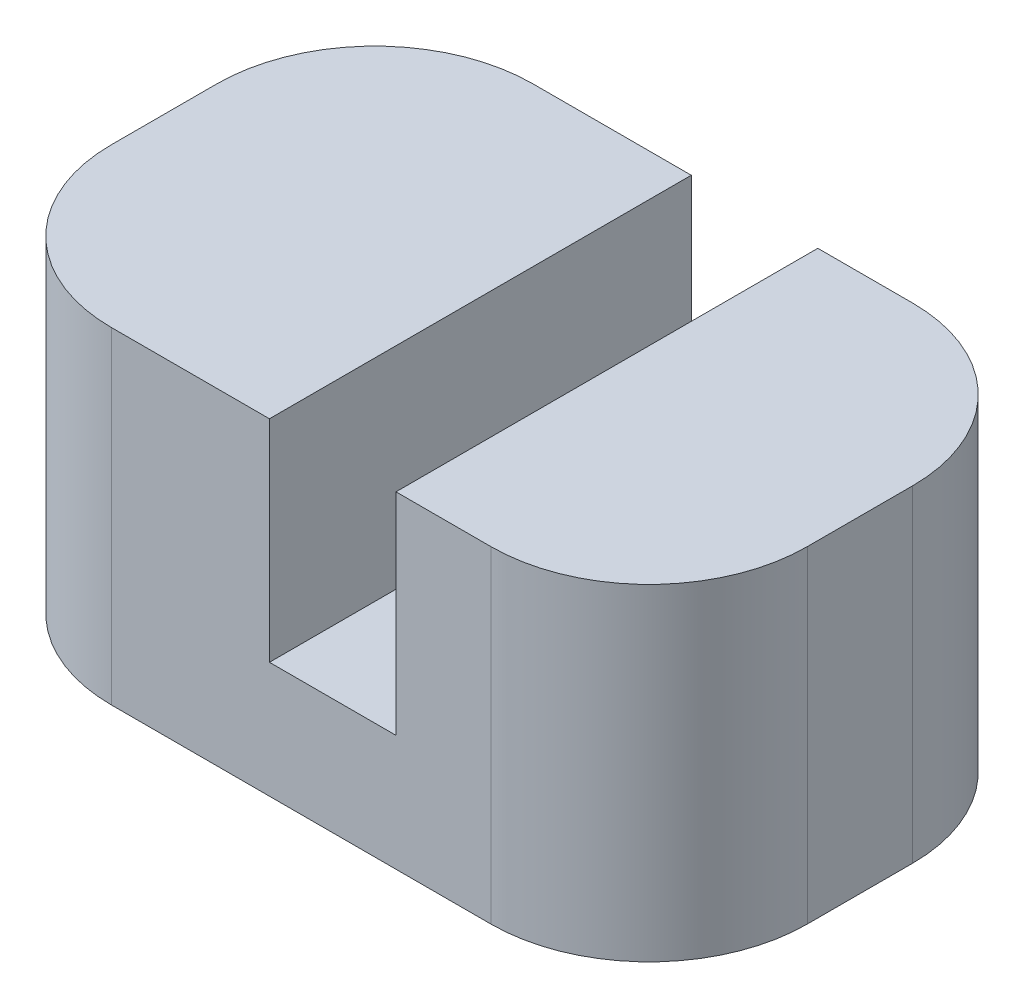
ISO-10303-21;
HEADER;
FILE_DESCRIPTION(('STEP AP214'),'2;1');
FILE_NAME('part.step','',(''),(''),'','','');
FILE_SCHEMA(('AUTOMOTIVE_DESIGN { 1 0 10303 214 1 1 1 1 }'));
ENDSEC;
DATA;
#1=APPLICATION_CONTEXT('core data for automotive mechanical design processes');
#2=APPLICATION_PROTOCOL_DEFINITION('international standard','automotive_design',2000,#1);
#3=PRODUCT_CONTEXT('',#1,'mechanical');
#4=PRODUCT('Part','Part','',(#3));
#5=PRODUCT_RELATED_PRODUCT_CATEGORY('part','',(#4));
#6=PRODUCT_DEFINITION_FORMATION('','',#4);
#7=PRODUCT_DEFINITION_CONTEXT('part definition',#1,'design');
#8=PRODUCT_DEFINITION('design','',#6,#7);
#9=PRODUCT_DEFINITION_SHAPE('','',#8);
#10=(LENGTH_UNIT() NAMED_UNIT(*) SI_UNIT(.MILLI.,.METRE.));
#11=(NAMED_UNIT(*) PLANE_ANGLE_UNIT() SI_UNIT($,.RADIAN.));
#12=(NAMED_UNIT(*) SI_UNIT($,.STERADIAN.) SOLID_ANGLE_UNIT());
#13=UNCERTAINTY_MEASURE_WITH_UNIT(LENGTH_MEASURE(1.E-05),#10,'distance_accuracy_value','');
#14=(GEOMETRIC_REPRESENTATION_CONTEXT(3) GLOBAL_UNCERTAINTY_ASSIGNED_CONTEXT((#13)) GLOBAL_UNIT_ASSIGNED_CONTEXT((#10,
#11,#12)) REPRESENTATION_CONTEXT('',''));
#15=CARTESIAN_POINT('',(0.,0.,0.));
#16=DIRECTION('',(0.,0.,1.));
#17=DIRECTION('',(1.,0.,0.));
#18=AXIS2_PLACEMENT_3D('',#15,#16,#17);
#19=CARTESIAN_POINT('',(0.,15.5,0.));
#20=DIRECTION('',(0.,-1.,0.));
#21=DIRECTION('',(0.,0.,-1.));
#22=AXIS2_PLACEMENT_3D('',#19,#20,#21);
#23=PLANE('',#22);
#24=DIRECTION('',(0.,0.,-1.));
#25=VECTOR('',#24,1.);
#26=CARTESIAN_POINT('',(15.,15.5,-9.99999999999998));
#27=LINE('',#26,#25);
#28=CARTESIAN_POINT('',(15.,15.5,2.50000000000002));
#29=VERTEX_POINT('',#28);
#30=CARTESIAN_POINT('',(15.,15.5,-2.49999999999998));
#31=VERTEX_POINT('',#30);
#32=EDGE_CURVE('E163',#29,#31,#27,.T.);
#33=ORIENTED_EDGE('',*,*,#32,.T.);
#34=CARTESIAN_POINT('',(7.5,15.5,-2.49999999999998));
#35=DIRECTION('',(0.,-1.,0.));
#36=DIRECTION('',(0.,0.,-1.));
#37=AXIS2_PLACEMENT_3D('',#34,#35,#36);
#38=CIRCLE('',#37,7.5);
#39=CARTESIAN_POINT('',(7.5,15.5,-9.99999999999998));
#40=VERTEX_POINT('',#39);
#41=EDGE_CURVE('E11',#31,#40,#38,.F.);
#42=ORIENTED_EDGE('',*,*,#41,.T.);
#43=DIRECTION('',(-1.,0.,0.));
#44=VECTOR('',#43,1.);
#45=CARTESIAN_POINT('',(15.,15.5,-9.99999999999998));
#46=LINE('',#45,#44);
#47=CARTESIAN_POINT('',(3.,15.5,-9.99999999999998));
#48=VERTEX_POINT('',#47);
#49=EDGE_CURVE('E167',#40,#48,#46,.T.);
#50=ORIENTED_EDGE('',*,*,#49,.T.);
#51=DIRECTION('',(0.,0.,-1.));
#52=VECTOR('',#51,1.);
#53=CARTESIAN_POINT('',(3.,15.5,9.99999999999999));
#54=LINE('',#53,#52);
#55=CARTESIAN_POINT('',(3.,15.5,9.99999999999999));
#56=VERTEX_POINT('',#55);
#57=EDGE_CURVE('E128',#56,#48,#54,.T.);
#58=ORIENTED_EDGE('',*,*,#57,.F.);
#59=DIRECTION('',(1.,0.,0.));
#60=VECTOR('',#59,1.);
#61=CARTESIAN_POINT('',(15.,15.5,10.));
#62=LINE('',#61,#60);
#63=CARTESIAN_POINT('',(7.5,15.5,10.));
#64=VERTEX_POINT('',#63);
#65=EDGE_CURVE('E172',#56,#64,#62,.T.);
#66=ORIENTED_EDGE('',*,*,#65,.T.);
#67=CARTESIAN_POINT('',(7.5,15.5,2.50000000000002));
#68=DIRECTION('',(0.,-1.,0.));
#69=DIRECTION('',(0.,0.,-1.));
#70=AXIS2_PLACEMENT_3D('',#67,#68,#69);
#71=CIRCLE('',#70,7.5);
#72=EDGE_CURVE('E41',#64,#29,#71,.F.);
#73=ORIENTED_EDGE('',*,*,#72,.T.);
#74=EDGE_LOOP('',(#33,#42,#50,#58,#66,#73));
#75=FACE_BOUND('',#74,.T.);
#76=ADVANCED_FACE('F33',(#75),#23,.F.);
#77=CARTESIAN_POINT('',(15.,15.5,-9.99999999999998));
#78=DIRECTION('',(-1.,0.,0.));
#79=DIRECTION('',(0.,0.,1.));
#80=AXIS2_PLACEMENT_3D('',#77,#78,#79);
#81=PLANE('',#80);
#82=DIRECTION('',(0.,0.,-1.));
#83=VECTOR('',#82,1.);
#84=CARTESIAN_POINT('',(15.,0.,-9.99999999999998));
#85=LINE('',#84,#83);
#86=CARTESIAN_POINT('',(15.,0.,2.50000000000002));
#87=VERTEX_POINT('',#86);
#88=CARTESIAN_POINT('',(15.,0.,-2.49999999999998));
#89=VERTEX_POINT('',#88);
#90=EDGE_CURVE('E158',#87,#89,#85,.T.);
#91=ORIENTED_EDGE('',*,*,#90,.T.);
#92=DIRECTION('',(0.,-1.,0.));
#93=VECTOR('',#92,1.);
#94=CARTESIAN_POINT('',(15.,15.5,-2.49999999999998));
#95=LINE('',#94,#93);
#96=EDGE_CURVE('E48',#89,#31,#95,.F.);
#97=ORIENTED_EDGE('',*,*,#96,.T.);
#98=ORIENTED_EDGE('',*,*,#32,.F.);
#99=DIRECTION('',(0.,-1.,0.));
#100=VECTOR('',#99,1.);
#101=CARTESIAN_POINT('',(15.,15.5,2.50000000000002));
#102=LINE('',#101,#100);
#103=EDGE_CURVE('E210',#29,#87,#102,.T.);
#104=ORIENTED_EDGE('',*,*,#103,.T.);
#105=EDGE_LOOP('',(#91,#97,#98,#104));
#106=FACE_BOUND('',#105,.T.);
#107=ADVANCED_FACE('F215',(#106),#81,.F.);
#108=CARTESIAN_POINT('',(15.,15.5,-9.99999999999998));
#109=DIRECTION('',(0.,0.,1.));
#110=DIRECTION('',(1.,0.,0.));
#111=AXIS2_PLACEMENT_3D('',#108,#109,#110);
#112=PLANE('',#111);
#113=DIRECTION('',(-1.,0.,0.));
#114=VECTOR('',#113,1.);
#115=CARTESIAN_POINT('',(15.,0.,-9.99999999999998));
#116=LINE('',#115,#114);
#117=CARTESIAN_POINT('',(7.5,0.,-9.99999999999998));
#118=VERTEX_POINT('',#117);
#119=CARTESIAN_POINT('',(-10.5,0.,-9.99999999999998));
#120=VERTEX_POINT('',#119);
#121=EDGE_CURVE('E177',#118,#120,#116,.T.);
#122=ORIENTED_EDGE('',*,*,#121,.T.);
#123=DIRECTION('',(0.,-1.,0.));
#124=VECTOR('',#123,1.);
#125=CARTESIAN_POINT('',(-10.5,15.5,-9.99999999999998));
#126=LINE('',#125,#124);
#127=CARTESIAN_POINT('',(-10.5,15.5,-9.99999999999998));
#128=VERTEX_POINT('',#127);
#129=EDGE_CURVE('E199',#120,#128,#126,.F.);
#130=ORIENTED_EDGE('',*,*,#129,.T.);
#131=CARTESIAN_POINT('',(-3.,15.5,-9.99999999999998));
#132=VERTEX_POINT('',#131);
#133=EDGE_CURVE('E165',#132,#128,#46,.T.);
#134=ORIENTED_EDGE('',*,*,#133,.F.);
#135=DIRECTION('',(0.,1.,0.));
#136=VECTOR('',#135,1.);
#137=CARTESIAN_POINT('',(-3.,5.5,-9.99999999999998));
#138=LINE('',#137,#136);
#139=CARTESIAN_POINT('',(-3.,5.5,-9.99999999999998));
#140=VERTEX_POINT('',#139);
#141=EDGE_CURVE('E132',#140,#132,#138,.T.);
#142=ORIENTED_EDGE('',*,*,#141,.F.);
#143=DIRECTION('',(-1.,0.,0.));
#144=VECTOR('',#143,1.);
#145=CARTESIAN_POINT('',(-3.,5.5,-9.99999999999998));
#146=LINE('',#145,#144);
#147=CARTESIAN_POINT('',(3.,5.5,-9.99999999999998));
#148=VERTEX_POINT('',#147);
#149=EDGE_CURVE('E139',#148,#140,#146,.T.);
#150=ORIENTED_EDGE('',*,*,#149,.F.);
#151=DIRECTION('',(0.,1.,0.));
#152=VECTOR('',#151,1.);
#153=CARTESIAN_POINT('',(3.,5.5,-9.99999999999998));
#154=LINE('',#153,#152);
#155=EDGE_CURVE('E122',#148,#48,#154,.T.);
#156=ORIENTED_EDGE('',*,*,#155,.T.);
#157=ORIENTED_EDGE('',*,*,#49,.F.);
#158=DIRECTION('',(0.,-1.,0.));
#159=VECTOR('',#158,1.);
#160=CARTESIAN_POINT('',(7.5,15.5,-9.99999999999998));
#161=LINE('',#160,#159);
#162=EDGE_CURVE('E196',#40,#118,#161,.T.);
#163=ORIENTED_EDGE('',*,*,#162,.T.);
#164=EDGE_LOOP('',(#122,#130,#134,#142,#150,#156,#157,#163));
#165=FACE_BOUND('',#164,.T.);
#166=ADVANCED_FACE('F146',(#165),#112,.F.);
#167=CARTESIAN_POINT('',(-18.,15.5,-9.99999999999998));
#168=DIRECTION('',(1.,0.,0.));
#169=DIRECTION('',(0.,0.,-1.));
#170=AXIS2_PLACEMENT_3D('',#167,#168,#169);
#171=PLANE('',#170);
#172=DIRECTION('',(0.,0.,1.));
#173=VECTOR('',#172,1.);
#174=CARTESIAN_POINT('',(-18.,15.5,-9.99999999999998));
#175=LINE('',#174,#173);
#176=CARTESIAN_POINT('',(-18.,15.5,-2.49999999999998));
#177=VERTEX_POINT('',#176);
#178=CARTESIAN_POINT('',(-18.,15.5,2.50000000000002));
#179=VERTEX_POINT('',#178);
#180=EDGE_CURVE('E169',#177,#179,#175,.T.);
#181=ORIENTED_EDGE('',*,*,#180,.F.);
#182=DIRECTION('',(0.,-1.,0.));
#183=VECTOR('',#182,1.);
#184=CARTESIAN_POINT('',(-18.,15.5,-2.49999999999998));
#185=LINE('',#184,#183);
#186=CARTESIAN_POINT('',(-18.,0.,-2.49999999999998));
#187=VERTEX_POINT('',#186);
#188=EDGE_CURVE('E185',#177,#187,#185,.T.);
#189=ORIENTED_EDGE('',*,*,#188,.T.);
#190=DIRECTION('',(0.,0.,1.));
#191=VECTOR('',#190,1.);
#192=CARTESIAN_POINT('',(-18.,0.,-9.99999999999998));
#193=LINE('',#192,#191);
#194=CARTESIAN_POINT('',(-18.,0.,2.50000000000002));
#195=VERTEX_POINT('',#194);
#196=EDGE_CURVE('E179',#187,#195,#193,.T.);
#197=ORIENTED_EDGE('',*,*,#196,.T.);
#198=DIRECTION('',(0.,-1.,0.));
#199=VECTOR('',#198,1.);
#200=CARTESIAN_POINT('',(-18.,15.5,2.50000000000002));
#201=LINE('',#200,#199);
#202=EDGE_CURVE('E175',#195,#179,#201,.F.);
#203=ORIENTED_EDGE('',*,*,#202,.T.);
#204=EDGE_LOOP('',(#181,#189,#197,#203));
#205=FACE_BOUND('',#204,.T.);
#206=ADVANCED_FACE('F252',(#205),#171,.F.);
#207=CARTESIAN_POINT('',(15.,15.5,10.));
#208=DIRECTION('',(0.,0.,-1.));
#209=DIRECTION('',(-1.,0.,0.));
#210=AXIS2_PLACEMENT_3D('',#207,#208,#209);
#211=PLANE('',#210);
#212=CARTESIAN_POINT('',(-10.5,15.5,10.));
#213=VERTEX_POINT('',#212);
#214=CARTESIAN_POINT('',(-3.,15.5,9.99999999999999));
#215=VERTEX_POINT('',#214);
#216=EDGE_CURVE('E173',#213,#215,#62,.T.);
#217=ORIENTED_EDGE('',*,*,#216,.F.);
#218=DIRECTION('',(0.,-1.,0.));
#219=VECTOR('',#218,1.);
#220=CARTESIAN_POINT('',(-10.5,15.5,10.));
#221=LINE('',#220,#219);
#222=CARTESIAN_POINT('',(-10.5,0.,10.));
#223=VERTEX_POINT('',#222);
#224=EDGE_CURVE('E207',#213,#223,#221,.T.);
#225=ORIENTED_EDGE('',*,*,#224,.T.);
#226=DIRECTION('',(1.,0.,0.));
#227=VECTOR('',#226,1.);
#228=CARTESIAN_POINT('',(15.,0.,10.));
#229=LINE('',#228,#227);
#230=CARTESIAN_POINT('',(7.5,0.,10.));
#231=VERTEX_POINT('',#230);
#232=EDGE_CURVE('E166',#223,#231,#229,.T.);
#233=ORIENTED_EDGE('',*,*,#232,.T.);
#234=DIRECTION('',(0.,-1.,0.));
#235=VECTOR('',#234,1.);
#236=CARTESIAN_POINT('',(7.5,15.5,10.));
#237=LINE('',#236,#235);
#238=EDGE_CURVE('E205',#231,#64,#237,.F.);
#239=ORIENTED_EDGE('',*,*,#238,.T.);
#240=ORIENTED_EDGE('',*,*,#65,.F.);
#241=DIRECTION('',(0.,1.,0.));
#242=VECTOR('',#241,1.);
#243=CARTESIAN_POINT('',(3.,5.5,9.99999999999999));
#244=LINE('',#243,#242);
#245=CARTESIAN_POINT('',(3.,5.5,9.99999999999999));
#246=VERTEX_POINT('',#245);
#247=EDGE_CURVE('E156',#246,#56,#244,.T.);
#248=ORIENTED_EDGE('',*,*,#247,.F.);
#249=DIRECTION('',(1.,0.,0.));
#250=VECTOR('',#249,1.);
#251=CARTESIAN_POINT('',(-3.,5.5,9.99999999999999));
#252=LINE('',#251,#250);
#253=CARTESIAN_POINT('',(-3.,5.5,9.99999999999999));
#254=VERTEX_POINT('',#253);
#255=EDGE_CURVE('E133',#254,#246,#252,.T.);
#256=ORIENTED_EDGE('',*,*,#255,.F.);
#257=DIRECTION('',(0.,1.,0.));
#258=VECTOR('',#257,1.);
#259=CARTESIAN_POINT('',(-3.,5.5,9.99999999999999));
#260=LINE('',#259,#258);
#261=EDGE_CURVE('E159',#254,#215,#260,.T.);
#262=ORIENTED_EDGE('',*,*,#261,.T.);
#263=EDGE_LOOP('',(#217,#225,#233,#239,#240,#248,#256,#262));
#264=FACE_BOUND('',#263,.T.);
#265=ADVANCED_FACE('F230',(#264),#211,.F.);
#266=ORIENTED_EDGE('',*,*,#133,.T.);
#267=CARTESIAN_POINT('',(-10.5,15.5,-2.49999999999998));
#268=DIRECTION('',(0.,-1.,0.));
#269=DIRECTION('',(0.,0.,-1.));
#270=AXIS2_PLACEMENT_3D('',#267,#268,#269);
#271=CIRCLE('',#270,7.5);
#272=EDGE_CURVE('E203',#128,#177,#271,.F.);
#273=ORIENTED_EDGE('',*,*,#272,.T.);
#274=ORIENTED_EDGE('',*,*,#180,.T.);
#275=CARTESIAN_POINT('',(-10.5,15.5,2.50000000000002));
#276=DIRECTION('',(0.,-1.,0.));
#277=DIRECTION('',(0.,0.,-1.));
#278=AXIS2_PLACEMENT_3D('',#275,#276,#277);
#279=CIRCLE('',#278,7.5);
#280=EDGE_CURVE('E201',#179,#213,#279,.F.);
#281=ORIENTED_EDGE('',*,*,#280,.T.);
#282=ORIENTED_EDGE('',*,*,#216,.T.);
#283=DIRECTION('',(0.,0.,1.));
#284=VECTOR('',#283,1.);
#285=CARTESIAN_POINT('',(-3.,15.5,9.99999999999999));
#286=LINE('',#285,#284);
#287=EDGE_CURVE('E143',#132,#215,#286,.T.);
#288=ORIENTED_EDGE('',*,*,#287,.F.);
#289=EDGE_LOOP('',(#266,#273,#274,#281,#282,#288));
#290=FACE_BOUND('',#289,.T.);
#291=ADVANCED_FACE('F239',(#290),#23,.F.);
#292=CARTESIAN_POINT('',(0.,0.,0.));
#293=DIRECTION('',(0.,-1.,0.));
#294=DIRECTION('',(0.,0.,-1.));
#295=AXIS2_PLACEMENT_3D('',#292,#293,#294);
#296=PLANE('',#295);
#297=ORIENTED_EDGE('',*,*,#196,.F.);
#298=CARTESIAN_POINT('',(-10.5,0.,-2.49999999999998));
#299=DIRECTION('',(0.,-1.,0.));
#300=DIRECTION('',(0.,0.,-1.));
#301=AXIS2_PLACEMENT_3D('',#298,#299,#300);
#302=CIRCLE('',#301,7.5);
#303=EDGE_CURVE('E194',#187,#120,#302,.T.);
#304=ORIENTED_EDGE('',*,*,#303,.T.);
#305=ORIENTED_EDGE('',*,*,#121,.F.);
#306=CARTESIAN_POINT('',(7.5,0.,-2.49999999999998));
#307=DIRECTION('',(0.,-1.,0.));
#308=DIRECTION('',(0.,0.,-1.));
#309=AXIS2_PLACEMENT_3D('',#306,#307,#308);
#310=CIRCLE('',#309,7.5);
#311=EDGE_CURVE('E190',#118,#89,#310,.T.);
#312=ORIENTED_EDGE('',*,*,#311,.T.);
#313=ORIENTED_EDGE('',*,*,#90,.F.);
#314=CARTESIAN_POINT('',(7.5,0.,2.50000000000002));
#315=DIRECTION('',(0.,-1.,0.));
#316=DIRECTION('',(0.,0.,-1.));
#317=AXIS2_PLACEMENT_3D('',#314,#315,#316);
#318=CIRCLE('',#317,7.5);
#319=EDGE_CURVE('E188',#87,#231,#318,.T.);
#320=ORIENTED_EDGE('',*,*,#319,.T.);
#321=ORIENTED_EDGE('',*,*,#232,.F.);
#322=CARTESIAN_POINT('',(-10.5,0.,2.50000000000002));
#323=DIRECTION('',(0.,-1.,0.));
#324=DIRECTION('',(0.,0.,-1.));
#325=AXIS2_PLACEMENT_3D('',#322,#323,#324);
#326=CIRCLE('',#325,7.5);
#327=EDGE_CURVE('E192',#223,#195,#326,.T.);
#328=ORIENTED_EDGE('',*,*,#327,.T.);
#329=EDGE_LOOP('',(#297,#304,#305,#312,#313,#320,#321,#328));
#330=FACE_BOUND('',#329,.T.);
#331=ADVANCED_FACE('F219',(#330),#296,.T.);
#332=CARTESIAN_POINT('',(3.,5.5,9.99999999999999));
#333=DIRECTION('',(1.,0.,0.));
#334=DIRECTION('',(0.,0.,-1.));
#335=AXIS2_PLACEMENT_3D('',#332,#333,#334);
#336=PLANE('',#335);
#337=ORIENTED_EDGE('',*,*,#57,.T.);
#338=ORIENTED_EDGE('',*,*,#155,.F.);
#339=DIRECTION('',(0.,0.,-1.));
#340=VECTOR('',#339,1.);
#341=CARTESIAN_POINT('',(3.,5.5,9.99999999999999));
#342=LINE('',#341,#340);
#343=EDGE_CURVE('E125',#246,#148,#342,.T.);
#344=ORIENTED_EDGE('',*,*,#343,.F.);
#345=ORIENTED_EDGE('',*,*,#247,.T.);
#346=EDGE_LOOP('',(#337,#338,#344,#345));
#347=FACE_BOUND('',#346,.T.);
#348=ADVANCED_FACE('F124',(#347),#336,.F.);
#349=CARTESIAN_POINT('',(-3.,5.5,9.99999999999999));
#350=DIRECTION('',(-1.,0.,0.));
#351=DIRECTION('',(0.,0.,1.));
#352=AXIS2_PLACEMENT_3D('',#349,#350,#351);
#353=PLANE('',#352);
#354=ORIENTED_EDGE('',*,*,#287,.T.);
#355=ORIENTED_EDGE('',*,*,#261,.F.);
#356=DIRECTION('',(0.,0.,1.));
#357=VECTOR('',#356,1.);
#358=CARTESIAN_POINT('',(-3.,5.5,9.99999999999999));
#359=LINE('',#358,#357);
#360=EDGE_CURVE('E148',#140,#254,#359,.T.);
#361=ORIENTED_EDGE('',*,*,#360,.F.);
#362=ORIENTED_EDGE('',*,*,#141,.T.);
#363=EDGE_LOOP('',(#354,#355,#361,#362));
#364=FACE_BOUND('',#363,.T.);
#365=ADVANCED_FACE('F267',(#364),#353,.F.);
#366=CARTESIAN_POINT('',(0.,5.5,0.));
#367=DIRECTION('',(0.,-1.,0.));
#368=DIRECTION('',(0.,0.,-1.));
#369=AXIS2_PLACEMENT_3D('',#366,#367,#368);
#370=PLANE('',#369);
#371=ORIENTED_EDGE('',*,*,#343,.T.);
#372=ORIENTED_EDGE('',*,*,#149,.T.);
#373=ORIENTED_EDGE('',*,*,#360,.T.);
#374=ORIENTED_EDGE('',*,*,#255,.T.);
#375=EDGE_LOOP('',(#371,#372,#373,#374));
#376=FACE_BOUND('',#375,.T.);
#377=ADVANCED_FACE('F137',(#376),#370,.F.);
#378=CARTESIAN_POINT('',(-10.5,15.5,-2.49999999999998));
#379=DIRECTION('',(0.,-1.,0.));
#380=DIRECTION('',(0.,0.,-1.));
#381=AXIS2_PLACEMENT_3D('',#378,#379,#380);
#382=CYLINDRICAL_SURFACE('',#381,7.5);
#383=ORIENTED_EDGE('',*,*,#272,.F.);
#384=ORIENTED_EDGE('',*,*,#129,.F.);
#385=ORIENTED_EDGE('',*,*,#303,.F.);
#386=ORIENTED_EDGE('',*,*,#188,.F.);
#387=EDGE_LOOP('',(#383,#384,#385,#386));
#388=FACE_BOUND('',#387,.T.);
#389=ADVANCED_FACE('F260',(#388),#382,.T.);
#390=CARTESIAN_POINT('',(-10.5,15.5,2.50000000000002));
#391=DIRECTION('',(0.,-1.,0.));
#392=DIRECTION('',(0.,0.,-1.));
#393=AXIS2_PLACEMENT_3D('',#390,#391,#392);
#394=CYLINDRICAL_SURFACE('',#393,7.5);
#395=ORIENTED_EDGE('',*,*,#280,.F.);
#396=ORIENTED_EDGE('',*,*,#202,.F.);
#397=ORIENTED_EDGE('',*,*,#327,.F.);
#398=ORIENTED_EDGE('',*,*,#224,.F.);
#399=EDGE_LOOP('',(#395,#396,#397,#398));
#400=FACE_BOUND('',#399,.T.);
#401=ADVANCED_FACE('F236',(#400),#394,.T.);
#402=CARTESIAN_POINT('',(7.5,15.5,-2.49999999999998));
#403=DIRECTION('',(0.,-1.,0.));
#404=DIRECTION('',(0.,0.,-1.));
#405=AXIS2_PLACEMENT_3D('',#402,#403,#404);
#406=CYLINDRICAL_SURFACE('',#405,7.5);
#407=ORIENTED_EDGE('',*,*,#41,.F.);
#408=ORIENTED_EDGE('',*,*,#96,.F.);
#409=ORIENTED_EDGE('',*,*,#311,.F.);
#410=ORIENTED_EDGE('',*,*,#162,.F.);
#411=EDGE_LOOP('',(#407,#408,#409,#410));
#412=FACE_BOUND('',#411,.T.);
#413=ADVANCED_FACE('F225',(#412),#406,.T.);
#414=CARTESIAN_POINT('',(7.5,15.5,2.50000000000002));
#415=DIRECTION('',(0.,-1.,0.));
#416=DIRECTION('',(0.,0.,-1.));
#417=AXIS2_PLACEMENT_3D('',#414,#415,#416);
#418=CYLINDRICAL_SURFACE('',#417,7.5);
#419=ORIENTED_EDGE('',*,*,#72,.F.);
#420=ORIENTED_EDGE('',*,*,#238,.F.);
#421=ORIENTED_EDGE('',*,*,#319,.F.);
#422=ORIENTED_EDGE('',*,*,#103,.F.);
#423=EDGE_LOOP('',(#419,#420,#421,#422));
#424=FACE_BOUND('',#423,.T.);
#425=ADVANCED_FACE('F35',(#424),#418,.T.);
#426=CLOSED_SHELL('',(#76,#107,#166,#206,#265,#291,#331,#348,#365,#377,#389,#401,#413,#425));
#427=MANIFOLD_SOLID_BREP('B2',#426);
#428=ADVANCED_BREP_SHAPE_REPRESENTATION('',(#18,#427),#14);
#429=SHAPE_DEFINITION_REPRESENTATION(#9,#428);
ENDSEC;
END-ISO-10303-21;
